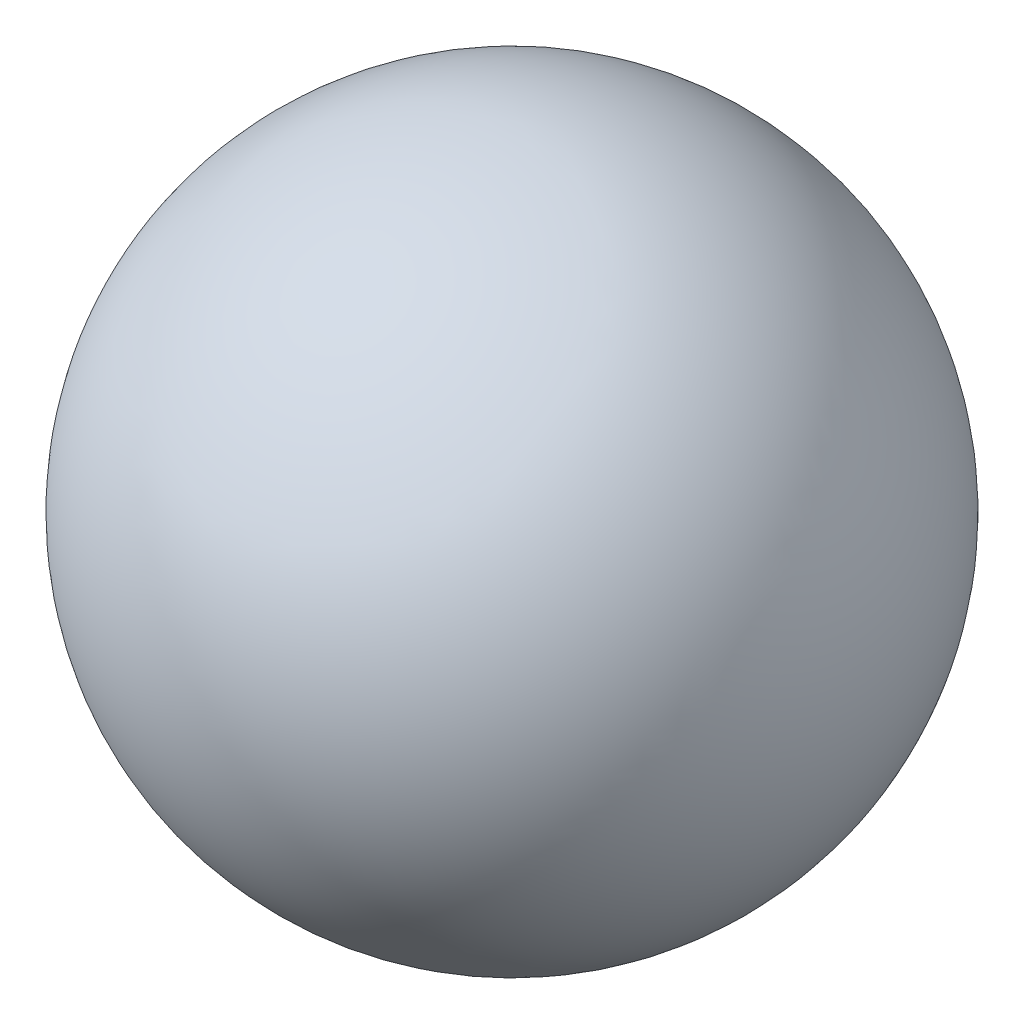
ISO-10303-21;
HEADER;
FILE_DESCRIPTION(('STEP AP214'),'2;1');
FILE_NAME('part.step','',(''),(''),'','','');
FILE_SCHEMA(('AUTOMOTIVE_DESIGN { 1 0 10303 214 1 1 1 1 }'));
ENDSEC;
DATA;
#1=APPLICATION_CONTEXT('core data for automotive mechanical design processes');
#2=APPLICATION_PROTOCOL_DEFINITION('international standard','automotive_design',2000,#1);
#3=PRODUCT_CONTEXT('',#1,'mechanical');
#4=PRODUCT('Part','Part','',(#3));
#5=PRODUCT_RELATED_PRODUCT_CATEGORY('part','',(#4));
#6=PRODUCT_DEFINITION_FORMATION('','',#4);
#7=PRODUCT_DEFINITION_CONTEXT('part definition',#1,'design');
#8=PRODUCT_DEFINITION('design','',#6,#7);
#9=PRODUCT_DEFINITION_SHAPE('','',#8);
#10=(LENGTH_UNIT() NAMED_UNIT(*) SI_UNIT(.MILLI.,.METRE.));
#11=(NAMED_UNIT(*) PLANE_ANGLE_UNIT() SI_UNIT($,.RADIAN.));
#12=(NAMED_UNIT(*) SI_UNIT($,.STERADIAN.) SOLID_ANGLE_UNIT());
#13=UNCERTAINTY_MEASURE_WITH_UNIT(LENGTH_MEASURE(1.E-05),#10,'distance_accuracy_value','');
#14=(GEOMETRIC_REPRESENTATION_CONTEXT(3) GLOBAL_UNCERTAINTY_ASSIGNED_CONTEXT((#13)) GLOBAL_UNIT_ASSIGNED_CONTEXT((#10,
#11,#12)) REPRESENTATION_CONTEXT('',''));
#15=CARTESIAN_POINT('',(0.,0.,0.));
#16=DIRECTION('',(0.,0.,1.));
#17=DIRECTION('',(1.,0.,0.));
#18=AXIS2_PLACEMENT_3D('',#15,#16,#17);
#19=CARTESIAN_POINT('',(22.6274169979695,0.,0.));
#20=DIRECTION('',(-1.,0.,0.));
#21=DIRECTION('',(0.,0.,-1.));
#22=AXIS2_PLACEMENT_3D('',#19,#20,#21);
#23=SPHERICAL_SURFACE('',#22,24.);
#24=CARTESIAN_POINT('',(0.,0.,0.));
#25=DIRECTION('',(-1.,0.,0.));
#26=DIRECTION('',(0.,0.,1.));
#27=AXIS2_PLACEMENT_3D('',#24,#25,#26);
#28=CIRCLE('',#27,8.);
#29=CARTESIAN_POINT('',(0.,0.,8.));
#30=VERTEX_POINT('',#29);
#31=EDGE_CURVE('E11',#30,#30,#28,.T.);
#32=ORIENTED_EDGE('',*,*,#31,.F.);
#33=EDGE_LOOP('',(#32));
#34=FACE_BOUND('',#33,.T.);
#35=ADVANCED_FACE('F40',(#34),#23,.T.);
#36=CARTESIAN_POINT('',(0.,0.,-8.));
#37=DIRECTION('',(1.,0.,0.));
#38=DIRECTION('',(0.,0.,-1.));
#39=AXIS2_PLACEMENT_3D('',#36,#37,#38);
#40=PLANE('',#39);
#41=CARTESIAN_POINT('',(0.,0.,0.));
#42=DIRECTION('',(-1.,0.,0.));
#43=DIRECTION('',(0.,0.,1.));
#44=AXIS2_PLACEMENT_3D('',#41,#42,#43);
#45=CIRCLE('',#44,6.025);
#46=CARTESIAN_POINT('',(0.,0.,6.025));
#47=VERTEX_POINT('',#46);
#48=EDGE_CURVE('E60',#47,#47,#45,.T.);
#49=ORIENTED_EDGE('',*,*,#48,.F.);
#50=EDGE_LOOP('',(#49));
#51=FACE_BOUND('',#50,.T.);
#52=ORIENTED_EDGE('',*,*,#31,.T.);
#53=EDGE_LOOP('',(#52));
#54=FACE_BOUND('',#53,.T.);
#55=ADVANCED_FACE('F53',(#51,#54),#40,.F.);
#56=CARTESIAN_POINT('',(30.,0.,0.));
#57=DIRECTION('',(-1.,0.,0.));
#58=DIRECTION('',(0.,0.,1.));
#59=AXIS2_PLACEMENT_3D('',#56,#57,#58);
#60=CONICAL_SURFACE('',#59,5.24999999999999,1.02974425867665);
#61=CARTESIAN_POINT('',(33.1545182498947,0.,0.));
#62=VERTEX_POINT('',#61);
#63=VERTEX_LOOP('',#62);
#64=FACE_BOUND('',#63,.T.);
#65=CARTESIAN_POINT('',(30.,0.,0.));
#66=DIRECTION('',(-1.,0.,0.));
#67=DIRECTION('',(0.,0.,1.));
#68=AXIS2_PLACEMENT_3D('',#65,#66,#67);
#69=CIRCLE('',#68,5.24999999999999);
#70=CARTESIAN_POINT('',(30.,0.,5.24999999999999));
#71=VERTEX_POINT('',#70);
#72=EDGE_CURVE('E46',#71,#71,#69,.T.);
#73=ORIENTED_EDGE('',*,*,#72,.T.);
#74=EDGE_LOOP('',(#73));
#75=FACE_BOUND('',#74,.T.);
#76=ADVANCED_FACE('F49',(#64,#75),#60,.F.);
#77=CARTESIAN_POINT('',(0.,0.,0.));
#78=DIRECTION('',(-1.,0.,0.));
#79=DIRECTION('',(0.,0.,1.));
#80=AXIS2_PLACEMENT_3D('',#77,#78,#79);
#81=CYLINDRICAL_SURFACE('',#80,5.24999999999999);
#82=ORIENTED_EDGE('',*,*,#72,.F.);
#83=EDGE_LOOP('',(#82));
#84=FACE_BOUND('',#83,.T.);
#85=CARTESIAN_POINT('',(0.775000000000005,0.,0.));
#86=DIRECTION('',(-1.,0.,0.));
#87=DIRECTION('',(0.,0.,1.));
#88=AXIS2_PLACEMENT_3D('',#85,#86,#87);
#89=CIRCLE('',#88,5.25);
#90=CARTESIAN_POINT('',(0.775000000000005,0.,5.25));
#91=VERTEX_POINT('',#90);
#92=EDGE_CURVE('E58',#91,#91,#89,.T.);
#93=ORIENTED_EDGE('',*,*,#92,.T.);
#94=EDGE_LOOP('',(#93));
#95=FACE_BOUND('',#94,.T.);
#96=ADVANCED_FACE('F52',(#84,#95),#81,.F.);
#97=CARTESIAN_POINT('',(0.,0.,0.));
#98=DIRECTION('',(-1.,0.,0.));
#99=DIRECTION('',(0.,0.,1.));
#100=AXIS2_PLACEMENT_3D('',#97,#98,#99);
#101=CONICAL_SURFACE('',#100,6.025,0.785398163397448);
#102=ORIENTED_EDGE('',*,*,#92,.F.);
#103=EDGE_LOOP('',(#102));
#104=FACE_BOUND('',#103,.T.);
#105=ORIENTED_EDGE('',*,*,#48,.T.);
#106=EDGE_LOOP('',(#105));
#107=FACE_BOUND('',#106,.T.);
#108=ADVANCED_FACE('F66',(#104,#107),#101,.F.);
#109=CLOSED_SHELL('',(#35,#55,#76,#96,#108));
#110=MANIFOLD_SOLID_BREP('B2',#109);
#111=ADVANCED_BREP_SHAPE_REPRESENTATION('',(#18,#110),#14);
#112=SHAPE_DEFINITION_REPRESENTATION(#9,#111);
ENDSEC;
END-ISO-10303-21;
